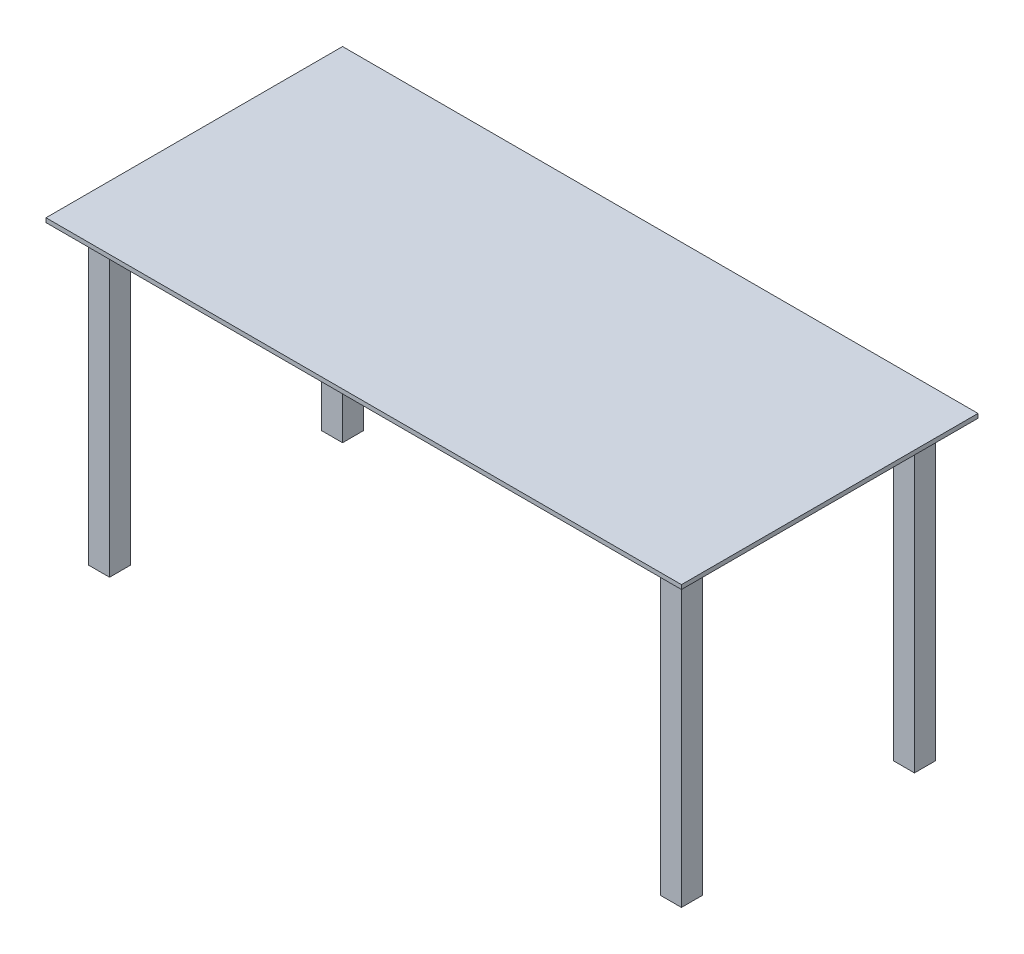
ISO-10303-21;
HEADER;
FILE_DESCRIPTION(('STEP AP214'),'2;1');
FILE_NAME('part.step','',(''),(''),'','','');
FILE_SCHEMA(('AUTOMOTIVE_DESIGN { 1 0 10303 214 1 1 1 1 }'));
ENDSEC;
DATA;
#1=APPLICATION_CONTEXT('core data for automotive mechanical design processes');
#2=APPLICATION_PROTOCOL_DEFINITION('international standard','automotive_design',2000,#1);
#3=PRODUCT_CONTEXT('',#1,'mechanical');
#4=PRODUCT('Part','Part','',(#3));
#5=PRODUCT_RELATED_PRODUCT_CATEGORY('part','',(#4));
#6=PRODUCT_DEFINITION_FORMATION('','',#4);
#7=PRODUCT_DEFINITION_CONTEXT('part definition',#1,'design');
#8=PRODUCT_DEFINITION('design','',#6,#7);
#9=PRODUCT_DEFINITION_SHAPE('','',#8);
#10=(LENGTH_UNIT() NAMED_UNIT(*) SI_UNIT(.MILLI.,.METRE.));
#11=(NAMED_UNIT(*) PLANE_ANGLE_UNIT() SI_UNIT($,.RADIAN.));
#12=(NAMED_UNIT(*) SI_UNIT($,.STERADIAN.) SOLID_ANGLE_UNIT());
#13=UNCERTAINTY_MEASURE_WITH_UNIT(LENGTH_MEASURE(1.E-05),#10,'distance_accuracy_value','');
#14=(GEOMETRIC_REPRESENTATION_CONTEXT(3) GLOBAL_UNCERTAINTY_ASSIGNED_CONTEXT((#13)) GLOBAL_UNIT_ASSIGNED_CONTEXT((#10,
#11,#12)) REPRESENTATION_CONTEXT('',''));
#15=CARTESIAN_POINT('',(0.,0.,0.));
#16=DIRECTION('',(0.,0.,1.));
#17=DIRECTION('',(1.,0.,0.));
#18=AXIS2_PLACEMENT_3D('',#15,#16,#17);
#19=CARTESIAN_POINT('',(0.,0.,0.));
#20=DIRECTION('',(0.,1.,0.));
#21=DIRECTION('',(0.,0.,1.));
#22=AXIS2_PLACEMENT_3D('',#19,#20,#21);
#23=PLANE('',#22);
#24=DIRECTION('',(0.,0.,1.));
#25=VECTOR('',#24,1.);
#26=CARTESIAN_POINT('',(700.,0.,-250.));
#27=LINE('',#26,#25);
#28=CARTESIAN_POINT('',(700.,0.,-300.));
#29=VERTEX_POINT('',#28);
#30=CARTESIAN_POINT('',(700.,0.,-250.));
#31=VERTEX_POINT('',#30);
#32=EDGE_CURVE('E175',#29,#31,#27,.T.);
#33=ORIENTED_EDGE('',*,*,#32,.F.);
#34=DIRECTION('',(1.,0.,0.));
#35=VECTOR('',#34,1.);
#36=CARTESIAN_POINT('',(650.,0.,-300.));
#37=LINE('',#36,#35);
#38=CARTESIAN_POINT('',(650.,0.,-300.));
#39=VERTEX_POINT('',#38);
#40=EDGE_CURVE('E188',#39,#29,#37,.T.);
#41=ORIENTED_EDGE('',*,*,#40,.F.);
#42=DIRECTION('',(0.,0.,-1.));
#43=VECTOR('',#42,1.);
#44=CARTESIAN_POINT('',(650.,0.,-250.));
#45=LINE('',#44,#43);
#46=CARTESIAN_POINT('',(650.,0.,-250.));
#47=VERTEX_POINT('',#46);
#48=EDGE_CURVE('E197',#47,#39,#45,.T.);
#49=ORIENTED_EDGE('',*,*,#48,.F.);
#50=DIRECTION('',(-1.,0.,0.));
#51=VECTOR('',#50,1.);
#52=CARTESIAN_POINT('',(650.,0.,-250.));
#53=LINE('',#52,#51);
#54=EDGE_CURVE('E178',#31,#47,#53,.T.);
#55=ORIENTED_EDGE('',*,*,#54,.F.);
#56=EDGE_LOOP('',(#33,#41,#49,#55));
#57=FACE_BOUND('',#56,.T.);
#58=DIRECTION('',(0.,0.,1.));
#59=VECTOR('',#58,1.);
#60=CARTESIAN_POINT('',(-650.,0.,300.));
#61=LINE('',#60,#59);
#62=CARTESIAN_POINT('',(-650.,0.,250.));
#63=VERTEX_POINT('',#62);
#64=CARTESIAN_POINT('',(-650.,0.,300.));
#65=VERTEX_POINT('',#64);
#66=EDGE_CURVE('E246',#63,#65,#61,.T.);
#67=ORIENTED_EDGE('',*,*,#66,.F.);
#68=DIRECTION('',(1.,0.,0.));
#69=VECTOR('',#68,1.);
#70=CARTESIAN_POINT('',(-700.,0.,250.));
#71=LINE('',#70,#69);
#72=CARTESIAN_POINT('',(-700.,0.,250.));
#73=VERTEX_POINT('',#72);
#74=EDGE_CURVE('E251',#73,#63,#71,.T.);
#75=ORIENTED_EDGE('',*,*,#74,.F.);
#76=DIRECTION('',(0.,0.,-1.));
#77=VECTOR('',#76,1.);
#78=CARTESIAN_POINT('',(-700.,0.,300.));
#79=LINE('',#78,#77);
#80=CARTESIAN_POINT('',(-700.,0.,300.));
#81=VERTEX_POINT('',#80);
#82=EDGE_CURVE('E263',#81,#73,#79,.T.);
#83=ORIENTED_EDGE('',*,*,#82,.F.);
#84=DIRECTION('',(-1.,0.,0.));
#85=VECTOR('',#84,1.);
#86=CARTESIAN_POINT('',(-700.,0.,300.));
#87=LINE('',#86,#85);
#88=EDGE_CURVE('E260',#65,#81,#87,.T.);
#89=ORIENTED_EDGE('',*,*,#88,.F.);
#90=EDGE_LOOP('',(#67,#75,#83,#89));
#91=FACE_BOUND('',#90,.T.);
#92=DIRECTION('',(0.,0.,-1.));
#93=VECTOR('',#92,1.);
#94=CARTESIAN_POINT('',(750.,0.,-350.));
#95=LINE('',#94,#93);
#96=CARTESIAN_POINT('',(750.,0.,350.));
#97=VERTEX_POINT('',#96);
#98=CARTESIAN_POINT('',(750.,0.,-350.));
#99=VERTEX_POINT('',#98);
#100=EDGE_CURVE('E279',#97,#99,#95,.T.);
#101=ORIENTED_EDGE('',*,*,#100,.F.);
#102=DIRECTION('',(1.,0.,0.));
#103=VECTOR('',#102,1.);
#104=CARTESIAN_POINT('',(-750.,0.,350.));
#105=LINE('',#104,#103);
#106=CARTESIAN_POINT('',(-750.,0.,350.));
#107=VERTEX_POINT('',#106);
#108=EDGE_CURVE('E284',#107,#97,#105,.T.);
#109=ORIENTED_EDGE('',*,*,#108,.F.);
#110=DIRECTION('',(0.,0.,1.));
#111=VECTOR('',#110,1.);
#112=CARTESIAN_POINT('',(-750.,0.,-350.));
#113=LINE('',#112,#111);
#114=CARTESIAN_POINT('',(-750.,0.,-350.));
#115=VERTEX_POINT('',#114);
#116=EDGE_CURVE('E295',#115,#107,#113,.T.);
#117=ORIENTED_EDGE('',*,*,#116,.F.);
#118=DIRECTION('',(-1.,0.,0.));
#119=VECTOR('',#118,1.);
#120=CARTESIAN_POINT('',(-750.,0.,-350.));
#121=LINE('',#120,#119);
#122=EDGE_CURVE('E293',#99,#115,#121,.T.);
#123=ORIENTED_EDGE('',*,*,#122,.F.);
#124=EDGE_LOOP('',(#101,#109,#117,#123));
#125=FACE_BOUND('',#124,.T.);
#126=DIRECTION('',(0.,0.,1.));
#127=VECTOR('',#126,1.);
#128=CARTESIAN_POINT('',(700.,0.,300.));
#129=LINE('',#128,#127);
#130=CARTESIAN_POINT('',(700.,0.,250.));
#131=VERTEX_POINT('',#130);
#132=CARTESIAN_POINT('',(700.,0.,300.));
#133=VERTEX_POINT('',#132);
#134=EDGE_CURVE('E213',#131,#133,#129,.T.);
#135=ORIENTED_EDGE('',*,*,#134,.F.);
#136=DIRECTION('',(1.,0.,0.));
#137=VECTOR('',#136,1.);
#138=CARTESIAN_POINT('',(650.,0.,250.));
#139=LINE('',#138,#137);
#140=CARTESIAN_POINT('',(650.,0.,250.));
#141=VERTEX_POINT('',#140);
#142=EDGE_CURVE('E218',#141,#131,#139,.T.);
#143=ORIENTED_EDGE('',*,*,#142,.F.);
#144=DIRECTION('',(0.,0.,-1.));
#145=VECTOR('',#144,1.);
#146=CARTESIAN_POINT('',(650.,0.,300.));
#147=LINE('',#146,#145);
#148=CARTESIAN_POINT('',(650.,0.,300.));
#149=VERTEX_POINT('',#148);
#150=EDGE_CURVE('E230',#149,#141,#147,.T.);
#151=ORIENTED_EDGE('',*,*,#150,.F.);
#152=DIRECTION('',(-1.,0.,0.));
#153=VECTOR('',#152,1.);
#154=CARTESIAN_POINT('',(650.,0.,300.));
#155=LINE('',#154,#153);
#156=EDGE_CURVE('E227',#133,#149,#155,.T.);
#157=ORIENTED_EDGE('',*,*,#156,.F.);
#158=EDGE_LOOP('',(#135,#143,#151,#157));
#159=FACE_BOUND('',#158,.T.);
#160=DIRECTION('',(0.,0.,1.));
#161=VECTOR('',#160,1.);
#162=CARTESIAN_POINT('',(-650.,0.,-250.));
#163=LINE('',#162,#161);
#164=CARTESIAN_POINT('',(-650.,0.,-300.));
#165=VERTEX_POINT('',#164);
#166=CARTESIAN_POINT('',(-650.,0.,-250.));
#167=VERTEX_POINT('',#166);
#168=EDGE_CURVE('E174',#165,#167,#163,.T.);
#169=ORIENTED_EDGE('',*,*,#168,.F.);
#170=DIRECTION('',(1.,0.,0.));
#171=VECTOR('',#170,1.);
#172=CARTESIAN_POINT('',(-700.,0.,-300.));
#173=LINE('',#172,#171);
#174=CARTESIAN_POINT('',(-700.,0.,-300.));
#175=VERTEX_POINT('',#174);
#176=EDGE_CURVE('E171',#175,#165,#173,.T.);
#177=ORIENTED_EDGE('',*,*,#176,.F.);
#178=DIRECTION('',(0.,0.,-1.));
#179=VECTOR('',#178,1.);
#180=CARTESIAN_POINT('',(-700.,0.,-250.));
#181=LINE('',#180,#179);
#182=CARTESIAN_POINT('',(-700.,0.,-250.));
#183=VERTEX_POINT('',#182);
#184=EDGE_CURVE('E37',#183,#175,#181,.T.);
#185=ORIENTED_EDGE('',*,*,#184,.F.);
#186=DIRECTION('',(-1.,0.,0.));
#187=VECTOR('',#186,1.);
#188=CARTESIAN_POINT('',(-700.,0.,-250.));
#189=LINE('',#188,#187);
#190=EDGE_CURVE('E32',#167,#183,#189,.T.);
#191=ORIENTED_EDGE('',*,*,#190,.F.);
#192=EDGE_LOOP('',(#169,#177,#185,#191));
#193=FACE_BOUND('',#192,.T.);
#194=ADVANCED_FACE('F17',(#57,#91,#125,#159,#193),#23,.F.);
#195=CARTESIAN_POINT('',(750.,10.,-350.));
#196=DIRECTION('',(-1.,0.,0.));
#197=DIRECTION('',(0.,0.,1.));
#198=AXIS2_PLACEMENT_3D('',#195,#196,#197);
#199=PLANE('',#198);
#200=ORIENTED_EDGE('',*,*,#100,.T.);
#201=DIRECTION('',(0.,-1.,0.));
#202=VECTOR('',#201,1.);
#203=CARTESIAN_POINT('',(750.,10.,-350.));
#204=LINE('',#203,#202);
#205=CARTESIAN_POINT('',(750.,10.,-350.));
#206=VERTEX_POINT('',#205);
#207=EDGE_CURVE('E11',#206,#99,#204,.T.);
#208=ORIENTED_EDGE('',*,*,#207,.F.);
#209=DIRECTION('',(0.,0.,-1.));
#210=VECTOR('',#209,1.);
#211=CARTESIAN_POINT('',(750.,10.,-350.));
#212=LINE('',#211,#210);
#213=CARTESIAN_POINT('',(750.,10.,350.));
#214=VERTEX_POINT('',#213);
#215=EDGE_CURVE('E280',#214,#206,#212,.T.);
#216=ORIENTED_EDGE('',*,*,#215,.F.);
#217=DIRECTION('',(0.,-1.,0.));
#218=VECTOR('',#217,1.);
#219=CARTESIAN_POINT('',(750.,10.,350.));
#220=LINE('',#219,#218);
#221=EDGE_CURVE('E290',#214,#97,#220,.T.);
#222=ORIENTED_EDGE('',*,*,#221,.T.);
#223=EDGE_LOOP('',(#200,#208,#216,#222));
#224=FACE_BOUND('',#223,.T.);
#225=ADVANCED_FACE('F19',(#224),#199,.F.);
#226=CARTESIAN_POINT('',(-750.,10.,-350.));
#227=DIRECTION('',(0.,0.,1.));
#228=DIRECTION('',(1.,0.,0.));
#229=AXIS2_PLACEMENT_3D('',#226,#227,#228);
#230=PLANE('',#229);
#231=ORIENTED_EDGE('',*,*,#122,.T.);
#232=DIRECTION('',(0.,-1.,0.));
#233=VECTOR('',#232,1.);
#234=CARTESIAN_POINT('',(-750.,10.,-350.));
#235=LINE('',#234,#233);
#236=CARTESIAN_POINT('',(-750.,10.,-350.));
#237=VERTEX_POINT('',#236);
#238=EDGE_CURVE('E25',#237,#115,#235,.T.);
#239=ORIENTED_EDGE('',*,*,#238,.F.);
#240=DIRECTION('',(-1.,0.,0.));
#241=VECTOR('',#240,1.);
#242=CARTESIAN_POINT('',(-750.,10.,-350.));
#243=LINE('',#242,#241);
#244=EDGE_CURVE('E283',#206,#237,#243,.T.);
#245=ORIENTED_EDGE('',*,*,#244,.F.);
#246=ORIENTED_EDGE('',*,*,#207,.T.);
#247=EDGE_LOOP('',(#231,#239,#245,#246));
#248=FACE_BOUND('',#247,.T.);
#249=ADVANCED_FACE('F323',(#248),#230,.F.);
#250=CARTESIAN_POINT('',(-750.,10.,-350.));
#251=DIRECTION('',(1.,0.,0.));
#252=DIRECTION('',(0.,0.,-1.));
#253=AXIS2_PLACEMENT_3D('',#250,#251,#252);
#254=PLANE('',#253);
#255=ORIENTED_EDGE('',*,*,#116,.T.);
#256=DIRECTION('',(0.,-1.,0.));
#257=VECTOR('',#256,1.);
#258=CARTESIAN_POINT('',(-750.,10.,350.));
#259=LINE('',#258,#257);
#260=CARTESIAN_POINT('',(-750.,10.,350.));
#261=VERTEX_POINT('',#260);
#262=EDGE_CURVE('E300',#261,#107,#259,.T.);
#263=ORIENTED_EDGE('',*,*,#262,.F.);
#264=DIRECTION('',(0.,0.,1.));
#265=VECTOR('',#264,1.);
#266=CARTESIAN_POINT('',(-750.,10.,-350.));
#267=LINE('',#266,#265);
#268=EDGE_CURVE('E286',#237,#261,#267,.T.);
#269=ORIENTED_EDGE('',*,*,#268,.F.);
#270=ORIENTED_EDGE('',*,*,#238,.T.);
#271=EDGE_LOOP('',(#255,#263,#269,#270));
#272=FACE_BOUND('',#271,.T.);
#273=ADVANCED_FACE('F307',(#272),#254,.F.);
#274=CARTESIAN_POINT('',(-750.,10.,350.));
#275=DIRECTION('',(0.,0.,-1.));
#276=DIRECTION('',(-1.,0.,0.));
#277=AXIS2_PLACEMENT_3D('',#274,#275,#276);
#278=PLANE('',#277);
#279=ORIENTED_EDGE('',*,*,#108,.T.);
#280=ORIENTED_EDGE('',*,*,#221,.F.);
#281=DIRECTION('',(1.,0.,0.));
#282=VECTOR('',#281,1.);
#283=CARTESIAN_POINT('',(-750.,10.,350.));
#284=LINE('',#283,#282);
#285=EDGE_CURVE('E288',#261,#214,#284,.T.);
#286=ORIENTED_EDGE('',*,*,#285,.F.);
#287=ORIENTED_EDGE('',*,*,#262,.T.);
#288=EDGE_LOOP('',(#279,#280,#286,#287));
#289=FACE_BOUND('',#288,.T.);
#290=ADVANCED_FACE('F316',(#289),#278,.F.);
#291=CARTESIAN_POINT('',(0.,10.,0.));
#292=DIRECTION('',(0.,1.,0.));
#293=DIRECTION('',(0.,0.,1.));
#294=AXIS2_PLACEMENT_3D('',#291,#292,#293);
#295=PLANE('',#294);
#296=ORIENTED_EDGE('',*,*,#215,.T.);
#297=ORIENTED_EDGE('',*,*,#244,.T.);
#298=ORIENTED_EDGE('',*,*,#268,.T.);
#299=ORIENTED_EDGE('',*,*,#285,.T.);
#300=EDGE_LOOP('',(#296,#297,#298,#299));
#301=FACE_BOUND('',#300,.T.);
#302=ADVANCED_FACE('F322',(#301),#295,.T.);
#303=CARTESIAN_POINT('',(-650.,-700.,300.));
#304=DIRECTION('',(-1.,0.,0.));
#305=DIRECTION('',(0.,0.,1.));
#306=AXIS2_PLACEMENT_3D('',#303,#304,#305);
#307=PLANE('',#306);
#308=ORIENTED_EDGE('',*,*,#66,.T.);
#309=DIRECTION('',(0.,1.,0.));
#310=VECTOR('',#309,1.);
#311=CARTESIAN_POINT('',(-650.,-700.,300.));
#312=LINE('',#311,#310);
#313=CARTESIAN_POINT('',(-650.,-700.,300.));
#314=VERTEX_POINT('',#313);
#315=EDGE_CURVE('E276',#314,#65,#312,.T.);
#316=ORIENTED_EDGE('',*,*,#315,.F.);
#317=DIRECTION('',(0.,0.,1.));
#318=VECTOR('',#317,1.);
#319=CARTESIAN_POINT('',(-650.,-700.,300.));
#320=LINE('',#319,#318);
#321=CARTESIAN_POINT('',(-650.,-700.,250.));
#322=VERTEX_POINT('',#321);
#323=EDGE_CURVE('E247',#322,#314,#320,.T.);
#324=ORIENTED_EDGE('',*,*,#323,.F.);
#325=DIRECTION('',(0.,1.,0.));
#326=VECTOR('',#325,1.);
#327=CARTESIAN_POINT('',(-650.,-700.,250.));
#328=LINE('',#327,#326);
#329=EDGE_CURVE('E257',#322,#63,#328,.T.);
#330=ORIENTED_EDGE('',*,*,#329,.T.);
#331=EDGE_LOOP('',(#308,#316,#324,#330));
#332=FACE_BOUND('',#331,.T.);
#333=ADVANCED_FACE('F347',(#332),#307,.F.);
#334=CARTESIAN_POINT('',(-700.,-700.,300.));
#335=DIRECTION('',(0.,0.,-1.));
#336=DIRECTION('',(-1.,0.,0.));
#337=AXIS2_PLACEMENT_3D('',#334,#335,#336);
#338=PLANE('',#337);
#339=ORIENTED_EDGE('',*,*,#88,.T.);
#340=DIRECTION('',(0.,1.,0.));
#341=VECTOR('',#340,1.);
#342=CARTESIAN_POINT('',(-700.,-700.,300.));
#343=LINE('',#342,#341);
#344=CARTESIAN_POINT('',(-700.,-700.,300.));
#345=VERTEX_POINT('',#344);
#346=EDGE_CURVE('E273',#345,#81,#343,.T.);
#347=ORIENTED_EDGE('',*,*,#346,.F.);
#348=DIRECTION('',(-1.,0.,0.));
#349=VECTOR('',#348,1.);
#350=CARTESIAN_POINT('',(-700.,-700.,300.));
#351=LINE('',#350,#349);
#352=EDGE_CURVE('E250',#314,#345,#351,.T.);
#353=ORIENTED_EDGE('',*,*,#352,.F.);
#354=ORIENTED_EDGE('',*,*,#315,.T.);
#355=EDGE_LOOP('',(#339,#347,#353,#354));
#356=FACE_BOUND('',#355,.T.);
#357=ADVANCED_FACE('F352',(#356),#338,.F.);
#358=CARTESIAN_POINT('',(-700.,-700.,300.));
#359=DIRECTION('',(1.,0.,0.));
#360=DIRECTION('',(0.,0.,-1.));
#361=AXIS2_PLACEMENT_3D('',#358,#359,#360);
#362=PLANE('',#361);
#363=ORIENTED_EDGE('',*,*,#82,.T.);
#364=DIRECTION('',(0.,1.,0.));
#365=VECTOR('',#364,1.);
#366=CARTESIAN_POINT('',(-700.,-700.,250.));
#367=LINE('',#366,#365);
#368=CARTESIAN_POINT('',(-700.,-700.,250.));
#369=VERTEX_POINT('',#368);
#370=EDGE_CURVE('E270',#369,#73,#367,.T.);
#371=ORIENTED_EDGE('',*,*,#370,.F.);
#372=DIRECTION('',(0.,0.,-1.));
#373=VECTOR('',#372,1.);
#374=CARTESIAN_POINT('',(-700.,-700.,300.));
#375=LINE('',#374,#373);
#376=EDGE_CURVE('E253',#345,#369,#375,.T.);
#377=ORIENTED_EDGE('',*,*,#376,.F.);
#378=ORIENTED_EDGE('',*,*,#346,.T.);
#379=EDGE_LOOP('',(#363,#371,#377,#378));
#380=FACE_BOUND('',#379,.T.);
#381=ADVANCED_FACE('F358',(#380),#362,.F.);
#382=CARTESIAN_POINT('',(-700.,-700.,250.));
#383=DIRECTION('',(0.,0.,1.));
#384=DIRECTION('',(1.,0.,0.));
#385=AXIS2_PLACEMENT_3D('',#382,#383,#384);
#386=PLANE('',#385);
#387=ORIENTED_EDGE('',*,*,#74,.T.);
#388=ORIENTED_EDGE('',*,*,#329,.F.);
#389=DIRECTION('',(1.,0.,0.));
#390=VECTOR('',#389,1.);
#391=CARTESIAN_POINT('',(-700.,-700.,250.));
#392=LINE('',#391,#390);
#393=EDGE_CURVE('E255',#369,#322,#392,.T.);
#394=ORIENTED_EDGE('',*,*,#393,.F.);
#395=ORIENTED_EDGE('',*,*,#370,.T.);
#396=EDGE_LOOP('',(#387,#388,#394,#395));
#397=FACE_BOUND('',#396,.T.);
#398=ADVANCED_FACE('F364',(#397),#386,.F.);
#399=CARTESIAN_POINT('',(0.,-700.,0.));
#400=DIRECTION('',(0.,-1.,0.));
#401=DIRECTION('',(0.,0.,-1.));
#402=AXIS2_PLACEMENT_3D('',#399,#400,#401);
#403=PLANE('',#402);
#404=ORIENTED_EDGE('',*,*,#323,.T.);
#405=ORIENTED_EDGE('',*,*,#352,.T.);
#406=ORIENTED_EDGE('',*,*,#376,.T.);
#407=ORIENTED_EDGE('',*,*,#393,.T.);
#408=EDGE_LOOP('',(#404,#405,#406,#407));
#409=FACE_BOUND('',#408,.T.);
#410=ADVANCED_FACE('F368',(#409),#403,.T.);
#411=CARTESIAN_POINT('',(700.,-700.,300.));
#412=DIRECTION('',(-1.,0.,0.));
#413=DIRECTION('',(0.,0.,1.));
#414=AXIS2_PLACEMENT_3D('',#411,#412,#413);
#415=PLANE('',#414);
#416=ORIENTED_EDGE('',*,*,#134,.T.);
#417=DIRECTION('',(0.,1.,0.));
#418=VECTOR('',#417,1.);
#419=CARTESIAN_POINT('',(700.,-700.,300.));
#420=LINE('',#419,#418);
#421=CARTESIAN_POINT('',(700.,-700.,300.));
#422=VERTEX_POINT('',#421);
#423=EDGE_CURVE('E243',#422,#133,#420,.T.);
#424=ORIENTED_EDGE('',*,*,#423,.F.);
#425=DIRECTION('',(0.,0.,1.));
#426=VECTOR('',#425,1.);
#427=CARTESIAN_POINT('',(700.,-700.,300.));
#428=LINE('',#427,#426);
#429=CARTESIAN_POINT('',(700.,-700.,250.));
#430=VERTEX_POINT('',#429);
#431=EDGE_CURVE('E214',#430,#422,#428,.T.);
#432=ORIENTED_EDGE('',*,*,#431,.F.);
#433=DIRECTION('',(0.,1.,0.));
#434=VECTOR('',#433,1.);
#435=CARTESIAN_POINT('',(700.,-700.,250.));
#436=LINE('',#435,#434);
#437=EDGE_CURVE('E224',#430,#131,#436,.T.);
#438=ORIENTED_EDGE('',*,*,#437,.T.);
#439=EDGE_LOOP('',(#416,#424,#432,#438));
#440=FACE_BOUND('',#439,.T.);
#441=ADVANCED_FACE('F372',(#440),#415,.F.);
#442=CARTESIAN_POINT('',(650.,-700.,300.));
#443=DIRECTION('',(0.,0.,-1.));
#444=DIRECTION('',(-1.,0.,0.));
#445=AXIS2_PLACEMENT_3D('',#442,#443,#444);
#446=PLANE('',#445);
#447=ORIENTED_EDGE('',*,*,#156,.T.);
#448=DIRECTION('',(0.,1.,0.));
#449=VECTOR('',#448,1.);
#450=CARTESIAN_POINT('',(650.,-700.,300.));
#451=LINE('',#450,#449);
#452=CARTESIAN_POINT('',(650.,-700.,300.));
#453=VERTEX_POINT('',#452);
#454=EDGE_CURVE('E240',#453,#149,#451,.T.);
#455=ORIENTED_EDGE('',*,*,#454,.F.);
#456=DIRECTION('',(-1.,0.,0.));
#457=VECTOR('',#456,1.);
#458=CARTESIAN_POINT('',(650.,-700.,300.));
#459=LINE('',#458,#457);
#460=EDGE_CURVE('E217',#422,#453,#459,.T.);
#461=ORIENTED_EDGE('',*,*,#460,.F.);
#462=ORIENTED_EDGE('',*,*,#423,.T.);
#463=EDGE_LOOP('',(#447,#455,#461,#462));
#464=FACE_BOUND('',#463,.T.);
#465=ADVANCED_FACE('F376',(#464),#446,.F.);
#466=CARTESIAN_POINT('',(650.,-700.,300.));
#467=DIRECTION('',(1.,0.,0.));
#468=DIRECTION('',(0.,0.,-1.));
#469=AXIS2_PLACEMENT_3D('',#466,#467,#468);
#470=PLANE('',#469);
#471=ORIENTED_EDGE('',*,*,#150,.T.);
#472=DIRECTION('',(0.,1.,0.));
#473=VECTOR('',#472,1.);
#474=CARTESIAN_POINT('',(650.,-700.,250.));
#475=LINE('',#474,#473);
#476=CARTESIAN_POINT('',(650.,-700.,250.));
#477=VERTEX_POINT('',#476);
#478=EDGE_CURVE('E237',#477,#141,#475,.T.);
#479=ORIENTED_EDGE('',*,*,#478,.F.);
#480=DIRECTION('',(0.,0.,-1.));
#481=VECTOR('',#480,1.);
#482=CARTESIAN_POINT('',(650.,-700.,300.));
#483=LINE('',#482,#481);
#484=EDGE_CURVE('E220',#453,#477,#483,.T.);
#485=ORIENTED_EDGE('',*,*,#484,.F.);
#486=ORIENTED_EDGE('',*,*,#454,.T.);
#487=EDGE_LOOP('',(#471,#479,#485,#486));
#488=FACE_BOUND('',#487,.T.);
#489=ADVANCED_FACE('F380',(#488),#470,.F.);
#490=CARTESIAN_POINT('',(650.,-700.,250.));
#491=DIRECTION('',(0.,0.,1.));
#492=DIRECTION('',(1.,0.,0.));
#493=AXIS2_PLACEMENT_3D('',#490,#491,#492);
#494=PLANE('',#493);
#495=ORIENTED_EDGE('',*,*,#142,.T.);
#496=ORIENTED_EDGE('',*,*,#437,.F.);
#497=DIRECTION('',(1.,0.,0.));
#498=VECTOR('',#497,1.);
#499=CARTESIAN_POINT('',(650.,-700.,250.));
#500=LINE('',#499,#498);
#501=EDGE_CURVE('E222',#477,#430,#500,.T.);
#502=ORIENTED_EDGE('',*,*,#501,.F.);
#503=ORIENTED_EDGE('',*,*,#478,.T.);
#504=EDGE_LOOP('',(#495,#496,#502,#503));
#505=FACE_BOUND('',#504,.T.);
#506=ADVANCED_FACE('F384',(#505),#494,.F.);
#507=CARTESIAN_POINT('',(0.,-700.,0.));
#508=DIRECTION('',(0.,-1.,0.));
#509=DIRECTION('',(0.,0.,-1.));
#510=AXIS2_PLACEMENT_3D('',#507,#508,#509);
#511=PLANE('',#510);
#512=ORIENTED_EDGE('',*,*,#431,.T.);
#513=ORIENTED_EDGE('',*,*,#460,.T.);
#514=ORIENTED_EDGE('',*,*,#484,.T.);
#515=ORIENTED_EDGE('',*,*,#501,.T.);
#516=EDGE_LOOP('',(#512,#513,#514,#515));
#517=FACE_BOUND('',#516,.T.);
#518=ADVANCED_FACE('F388',(#517),#511,.T.);
#519=CARTESIAN_POINT('',(700.,-700.,-250.));
#520=DIRECTION('',(-1.,0.,0.));
#521=DIRECTION('',(0.,0.,1.));
#522=AXIS2_PLACEMENT_3D('',#519,#520,#521);
#523=PLANE('',#522);
#524=ORIENTED_EDGE('',*,*,#32,.T.);
#525=DIRECTION('',(0.,1.,0.));
#526=VECTOR('',#525,1.);
#527=CARTESIAN_POINT('',(700.,-700.,-250.));
#528=LINE('',#527,#526);
#529=CARTESIAN_POINT('',(700.,-700.,-250.));
#530=VERTEX_POINT('',#529);
#531=EDGE_CURVE('E210',#530,#31,#528,.T.);
#532=ORIENTED_EDGE('',*,*,#531,.F.);
#533=DIRECTION('',(0.,0.,1.));
#534=VECTOR('',#533,1.);
#535=CARTESIAN_POINT('',(700.,-700.,-250.));
#536=LINE('',#535,#534);
#537=CARTESIAN_POINT('',(700.,-700.,-300.));
#538=VERTEX_POINT('',#537);
#539=EDGE_CURVE('E184',#538,#530,#536,.T.);
#540=ORIENTED_EDGE('',*,*,#539,.F.);
#541=DIRECTION('',(0.,1.,0.));
#542=VECTOR('',#541,1.);
#543=CARTESIAN_POINT('',(700.,-700.,-300.));
#544=LINE('',#543,#542);
#545=EDGE_CURVE('E193',#538,#29,#544,.T.);
#546=ORIENTED_EDGE('',*,*,#545,.T.);
#547=EDGE_LOOP('',(#524,#532,#540,#546));
#548=FACE_BOUND('',#547,.T.);
#549=ADVANCED_FACE('F392',(#548),#523,.F.);
#550=CARTESIAN_POINT('',(650.,-700.,-250.));
#551=DIRECTION('',(0.,0.,-1.));
#552=DIRECTION('',(-1.,0.,0.));
#553=AXIS2_PLACEMENT_3D('',#550,#551,#552);
#554=PLANE('',#553);
#555=ORIENTED_EDGE('',*,*,#54,.T.);
#556=DIRECTION('',(0.,1.,0.));
#557=VECTOR('',#556,1.);
#558=CARTESIAN_POINT('',(650.,-700.,-250.));
#559=LINE('',#558,#557);
#560=CARTESIAN_POINT('',(650.,-700.,-250.));
#561=VERTEX_POINT('',#560);
#562=EDGE_CURVE('E207',#561,#47,#559,.T.);
#563=ORIENTED_EDGE('',*,*,#562,.F.);
#564=DIRECTION('',(-1.,0.,0.));
#565=VECTOR('',#564,1.);
#566=CARTESIAN_POINT('',(650.,-700.,-250.));
#567=LINE('',#566,#565);
#568=EDGE_CURVE('E187',#530,#561,#567,.T.);
#569=ORIENTED_EDGE('',*,*,#568,.F.);
#570=ORIENTED_EDGE('',*,*,#531,.T.);
#571=EDGE_LOOP('',(#555,#563,#569,#570));
#572=FACE_BOUND('',#571,.T.);
#573=ADVANCED_FACE('F396',(#572),#554,.F.);
#574=CARTESIAN_POINT('',(650.,-700.,-250.));
#575=DIRECTION('',(1.,0.,0.));
#576=DIRECTION('',(0.,0.,-1.));
#577=AXIS2_PLACEMENT_3D('',#574,#575,#576);
#578=PLANE('',#577);
#579=ORIENTED_EDGE('',*,*,#48,.T.);
#580=DIRECTION('',(0.,1.,0.));
#581=VECTOR('',#580,1.);
#582=CARTESIAN_POINT('',(650.,-700.,-300.));
#583=LINE('',#582,#581);
#584=CARTESIAN_POINT('',(650.,-700.,-300.));
#585=VERTEX_POINT('',#584);
#586=EDGE_CURVE('E204',#585,#39,#583,.T.);
#587=ORIENTED_EDGE('',*,*,#586,.F.);
#588=DIRECTION('',(0.,0.,-1.));
#589=VECTOR('',#588,1.);
#590=CARTESIAN_POINT('',(650.,-700.,-250.));
#591=LINE('',#590,#589);
#592=EDGE_CURVE('E190',#561,#585,#591,.T.);
#593=ORIENTED_EDGE('',*,*,#592,.F.);
#594=ORIENTED_EDGE('',*,*,#562,.T.);
#595=EDGE_LOOP('',(#579,#587,#593,#594));
#596=FACE_BOUND('',#595,.T.);
#597=ADVANCED_FACE('F400',(#596),#578,.F.);
#598=CARTESIAN_POINT('',(650.,-700.,-300.));
#599=DIRECTION('',(0.,0.,1.));
#600=DIRECTION('',(1.,0.,0.));
#601=AXIS2_PLACEMENT_3D('',#598,#599,#600);
#602=PLANE('',#601);
#603=ORIENTED_EDGE('',*,*,#40,.T.);
#604=ORIENTED_EDGE('',*,*,#545,.F.);
#605=DIRECTION('',(1.,0.,0.));
#606=VECTOR('',#605,1.);
#607=CARTESIAN_POINT('',(650.,-700.,-300.));
#608=LINE('',#607,#606);
#609=EDGE_CURVE('E192',#585,#538,#608,.T.);
#610=ORIENTED_EDGE('',*,*,#609,.F.);
#611=ORIENTED_EDGE('',*,*,#586,.T.);
#612=EDGE_LOOP('',(#603,#604,#610,#611));
#613=FACE_BOUND('',#612,.T.);
#614=ADVANCED_FACE('F404',(#613),#602,.F.);
#615=CARTESIAN_POINT('',(0.,-700.,0.));
#616=DIRECTION('',(0.,-1.,0.));
#617=DIRECTION('',(0.,0.,-1.));
#618=AXIS2_PLACEMENT_3D('',#615,#616,#617);
#619=PLANE('',#618);
#620=ORIENTED_EDGE('',*,*,#539,.T.);
#621=ORIENTED_EDGE('',*,*,#568,.T.);
#622=ORIENTED_EDGE('',*,*,#592,.T.);
#623=ORIENTED_EDGE('',*,*,#609,.T.);
#624=EDGE_LOOP('',(#620,#621,#622,#623));
#625=FACE_BOUND('',#624,.T.);
#626=ADVANCED_FACE('F408',(#625),#619,.T.);
#627=CARTESIAN_POINT('',(-650.,-700.,-250.));
#628=DIRECTION('',(-1.,0.,0.));
#629=DIRECTION('',(0.,0.,1.));
#630=AXIS2_PLACEMENT_3D('',#627,#628,#629);
#631=PLANE('',#630);
#632=ORIENTED_EDGE('',*,*,#168,.T.);
#633=DIRECTION('',(0.,1.,0.));
#634=VECTOR('',#633,1.);
#635=CARTESIAN_POINT('',(-650.,-700.,-250.));
#636=LINE('',#635,#634);
#637=CARTESIAN_POINT('',(-650.,-700.,-250.));
#638=VERTEX_POINT('',#637);
#639=EDGE_CURVE('E155',#638,#167,#636,.T.);
#640=ORIENTED_EDGE('',*,*,#639,.F.);
#641=DIRECTION('',(0.,0.,1.));
#642=VECTOR('',#641,1.);
#643=CARTESIAN_POINT('',(-650.,-700.,-250.));
#644=LINE('',#643,#642);
#645=CARTESIAN_POINT('',(-650.,-700.,-300.));
#646=VERTEX_POINT('',#645);
#647=EDGE_CURVE('E162',#646,#638,#644,.T.);
#648=ORIENTED_EDGE('',*,*,#647,.F.);
#649=DIRECTION('',(0.,1.,0.));
#650=VECTOR('',#649,1.);
#651=CARTESIAN_POINT('',(-650.,-700.,-300.));
#652=LINE('',#651,#650);
#653=EDGE_CURVE('E576',#646,#165,#652,.T.);
#654=ORIENTED_EDGE('',*,*,#653,.T.);
#655=EDGE_LOOP('',(#632,#640,#648,#654));
#656=FACE_BOUND('',#655,.T.);
#657=ADVANCED_FACE('F173',(#656),#631,.F.);
#658=CARTESIAN_POINT('',(-700.,-700.,-250.));
#659=DIRECTION('',(0.,0.,-1.));
#660=DIRECTION('',(-1.,0.,0.));
#661=AXIS2_PLACEMENT_3D('',#658,#659,#660);
#662=PLANE('',#661);
#663=ORIENTED_EDGE('',*,*,#190,.T.);
#664=DIRECTION('',(0.,1.,0.));
#665=VECTOR('',#664,1.);
#666=CARTESIAN_POINT('',(-700.,-700.,-250.));
#667=LINE('',#666,#665);
#668=CARTESIAN_POINT('',(-700.,-700.,-250.));
#669=VERTEX_POINT('',#668);
#670=EDGE_CURVE('E158',#669,#183,#667,.T.);
#671=ORIENTED_EDGE('',*,*,#670,.F.);
#672=DIRECTION('',(-1.,0.,0.));
#673=VECTOR('',#672,1.);
#674=CARTESIAN_POINT('',(-700.,-700.,-250.));
#675=LINE('',#674,#673);
#676=EDGE_CURVE('E151',#638,#669,#675,.T.);
#677=ORIENTED_EDGE('',*,*,#676,.F.);
#678=ORIENTED_EDGE('',*,*,#639,.T.);
#679=EDGE_LOOP('',(#663,#671,#677,#678));
#680=FACE_BOUND('',#679,.T.);
#681=ADVANCED_FACE('F153',(#680),#662,.F.);
#682=CARTESIAN_POINT('',(-700.,-700.,-250.));
#683=DIRECTION('',(1.,0.,0.));
#684=DIRECTION('',(0.,0.,-1.));
#685=AXIS2_PLACEMENT_3D('',#682,#683,#684);
#686=PLANE('',#685);
#687=ORIENTED_EDGE('',*,*,#184,.T.);
#688=DIRECTION('',(0.,1.,0.));
#689=VECTOR('',#688,1.);
#690=CARTESIAN_POINT('',(-700.,-700.,-300.));
#691=LINE('',#690,#689);
#692=CARTESIAN_POINT('',(-700.,-700.,-300.));
#693=VERTEX_POINT('',#692);
#694=EDGE_CURVE('E180',#693,#175,#691,.T.);
#695=ORIENTED_EDGE('',*,*,#694,.F.);
#696=DIRECTION('',(0.,0.,-1.));
#697=VECTOR('',#696,1.);
#698=CARTESIAN_POINT('',(-700.,-700.,-250.));
#699=LINE('',#698,#697);
#700=EDGE_CURVE('E161',#669,#693,#699,.T.);
#701=ORIENTED_EDGE('',*,*,#700,.F.);
#702=ORIENTED_EDGE('',*,*,#670,.T.);
#703=EDGE_LOOP('',(#687,#695,#701,#702));
#704=FACE_BOUND('',#703,.T.);
#705=ADVANCED_FACE('F417',(#704),#686,.F.);
#706=CARTESIAN_POINT('',(-700.,-700.,-300.));
#707=DIRECTION('',(0.,0.,1.));
#708=DIRECTION('',(1.,0.,0.));
#709=AXIS2_PLACEMENT_3D('',#706,#707,#708);
#710=PLANE('',#709);
#711=ORIENTED_EDGE('',*,*,#176,.T.);
#712=ORIENTED_EDGE('',*,*,#653,.F.);
#713=DIRECTION('',(1.,0.,0.));
#714=VECTOR('',#713,1.);
#715=CARTESIAN_POINT('',(-700.,-700.,-300.));
#716=LINE('',#715,#714);
#717=EDGE_CURVE('E167',#693,#646,#716,.T.);
#718=ORIENTED_EDGE('',*,*,#717,.F.);
#719=ORIENTED_EDGE('',*,*,#694,.T.);
#720=EDGE_LOOP('',(#711,#712,#718,#719));
#721=FACE_BOUND('',#720,.T.);
#722=ADVANCED_FACE('F420',(#721),#710,.F.);
#723=CARTESIAN_POINT('',(0.,-700.,0.));
#724=DIRECTION('',(0.,-1.,0.));
#725=DIRECTION('',(0.,0.,-1.));
#726=AXIS2_PLACEMENT_3D('',#723,#724,#725);
#727=PLANE('',#726);
#728=ORIENTED_EDGE('',*,*,#647,.T.);
#729=ORIENTED_EDGE('',*,*,#676,.T.);
#730=ORIENTED_EDGE('',*,*,#700,.T.);
#731=ORIENTED_EDGE('',*,*,#717,.T.);
#732=EDGE_LOOP('',(#728,#729,#730,#731));
#733=FACE_BOUND('',#732,.T.);
#734=ADVANCED_FACE('F165',(#733),#727,.T.);
#735=CLOSED_SHELL('',(#194,#225,#249,#273,#290,#302,#333,#357,#381,#398,#410,#441,#465,#489,
#506,#518,#549,#573,#597,#614,#626,#657,#681,#705,#722,#734));
#736=MANIFOLD_SOLID_BREP('B1',#735);
#737=ADVANCED_BREP_SHAPE_REPRESENTATION('',(#18,#736),#14);
#738=SHAPE_DEFINITION_REPRESENTATION(#9,#737);
ENDSEC;
END-ISO-10303-21;
